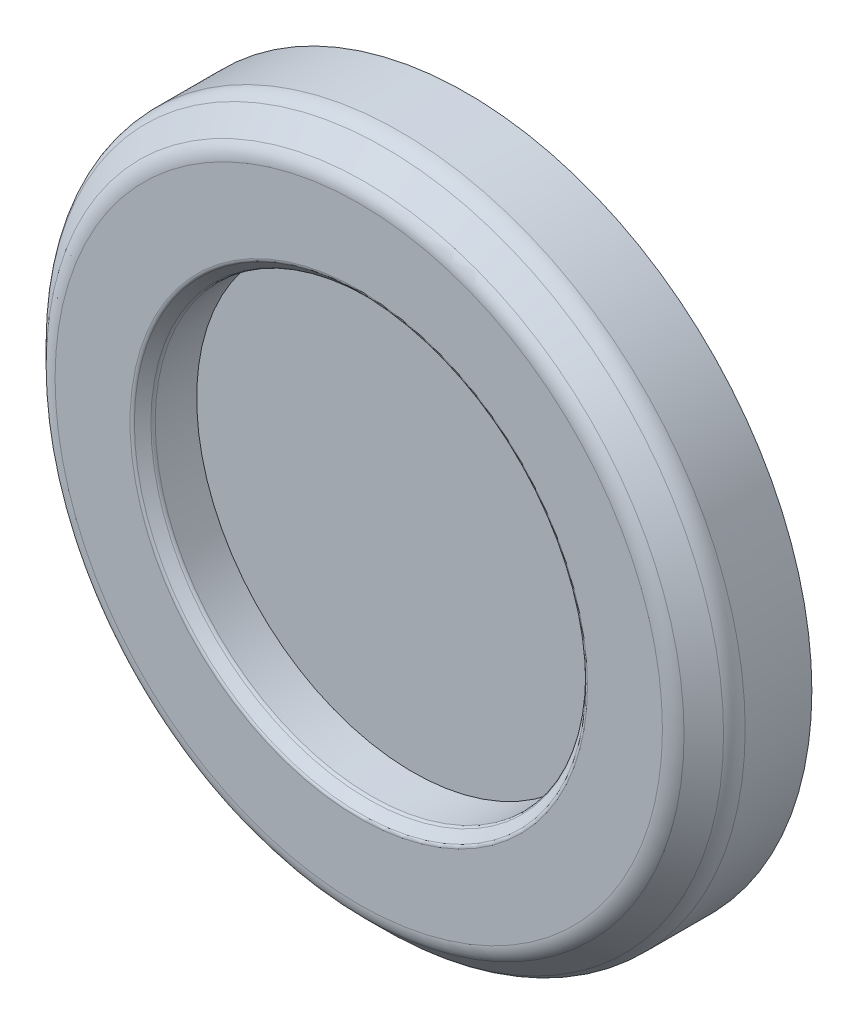
ISO-10303-21;
HEADER;
FILE_DESCRIPTION(('STEP AP214'),'2;1');
FILE_NAME('part.step','',(''),(''),'','','');
FILE_SCHEMA(('AUTOMOTIVE_DESIGN { 1 0 10303 214 1 1 1 1 }'));
ENDSEC;
DATA;
#1=APPLICATION_CONTEXT('core data for automotive mechanical design processes');
#2=APPLICATION_PROTOCOL_DEFINITION('international standard','automotive_design',2000,#1);
#3=PRODUCT_CONTEXT('',#1,'mechanical');
#4=PRODUCT('Part','Part','',(#3));
#5=PRODUCT_RELATED_PRODUCT_CATEGORY('part','',(#4));
#6=PRODUCT_DEFINITION_FORMATION('','',#4);
#7=PRODUCT_DEFINITION_CONTEXT('part definition',#1,'design');
#8=PRODUCT_DEFINITION('design','',#6,#7);
#9=PRODUCT_DEFINITION_SHAPE('','',#8);
#10=(LENGTH_UNIT() NAMED_UNIT(*) SI_UNIT(.MILLI.,.METRE.));
#11=(NAMED_UNIT(*) PLANE_ANGLE_UNIT() SI_UNIT($,.RADIAN.));
#12=(NAMED_UNIT(*) SI_UNIT($,.STERADIAN.) SOLID_ANGLE_UNIT());
#13=UNCERTAINTY_MEASURE_WITH_UNIT(LENGTH_MEASURE(1.E-05),#10,'distance_accuracy_value','');
#14=(GEOMETRIC_REPRESENTATION_CONTEXT(3) GLOBAL_UNCERTAINTY_ASSIGNED_CONTEXT((#13)) GLOBAL_UNIT_ASSIGNED_CONTEXT((#10,
#11,#12)) REPRESENTATION_CONTEXT('',''));
#15=CARTESIAN_POINT('',(0.,0.,0.));
#16=DIRECTION('',(0.,0.,1.));
#17=DIRECTION('',(1.,0.,0.));
#18=AXIS2_PLACEMENT_3D('',#15,#16,#17);
#19=CARTESIAN_POINT('',(0.,0.,10.));
#20=DIRECTION('',(0.,0.,-1.));
#21=DIRECTION('',(-1.,0.,0.));
#22=AXIS2_PLACEMENT_3D('',#19,#20,#21);
#23=CYLINDRICAL_SURFACE('',#22,31.93);
#24=CARTESIAN_POINT('',(0.,0.,6.17157287525377));
#25=DIRECTION('',(0.,0.,1.));
#26=DIRECTION('',(1.,0.,0.));
#27=AXIS2_PLACEMENT_3D('',#24,#25,#26);
#28=CIRCLE('',#27,31.93);
#29=CARTESIAN_POINT('',(31.93,0.,6.17157287525377));
#30=VERTEX_POINT('',#29);
#31=EDGE_CURVE('E70',#30,#30,#28,.F.);
#32=ORIENTED_EDGE('',*,*,#31,.T.);
#33=EDGE_LOOP('',(#32));
#34=FACE_BOUND('',#33,.T.);
#35=CARTESIAN_POINT('',(0.,0.,0.));
#36=DIRECTION('',(0.,0.,1.));
#37=DIRECTION('',(1.,0.,0.));
#38=AXIS2_PLACEMENT_3D('',#35,#36,#37);
#39=CIRCLE('',#38,31.93);
#40=CARTESIAN_POINT('',(31.93,0.,0.));
#41=VERTEX_POINT('',#40);
#42=EDGE_CURVE('E72',#41,#41,#39,.T.);
#43=ORIENTED_EDGE('',*,*,#42,.T.);
#44=EDGE_LOOP('',(#43));
#45=FACE_BOUND('',#44,.T.);
#46=ADVANCED_FACE('F39',(#34,#45),#23,.T.);
#47=CARTESIAN_POINT('',(0.,0.,10.));
#48=DIRECTION('',(0.,0.,1.));
#49=DIRECTION('',(1.,0.,0.));
#50=AXIS2_PLACEMENT_3D('',#47,#48,#49);
#51=PLANE('',#50);
#52=CARTESIAN_POINT('',(0.,0.,10.));
#53=DIRECTION('',(0.,0.,1.));
#54=DIRECTION('',(1.,0.,0.));
#55=AXIS2_PLACEMENT_3D('',#52,#53,#54);
#56=CIRCLE('',#55,21.1656854249493);
#57=CARTESIAN_POINT('',(21.1656854249493,0.,10.));
#58=VERTEX_POINT('',#57);
#59=EDGE_CURVE('E10',#58,#58,#56,.F.);
#60=ORIENTED_EDGE('',*,*,#59,.T.);
#61=EDGE_LOOP('',(#60));
#62=FACE_BOUND('',#61,.T.);
#63=CARTESIAN_POINT('',(0.,0.,10.));
#64=DIRECTION('',(0.,0.,1.));
#65=DIRECTION('',(1.,0.,0.));
#66=AXIS2_PLACEMENT_3D('',#63,#64,#65);
#67=CIRCLE('',#66,28.1015728752538);
#68=CARTESIAN_POINT('',(28.1015728752538,0.,10.));
#69=VERTEX_POINT('',#68);
#70=EDGE_CURVE('E56',#69,#69,#67,.T.);
#71=ORIENTED_EDGE('',*,*,#70,.T.);
#72=EDGE_LOOP('',(#71));
#73=FACE_BOUND('',#72,.T.);
#74=ADVANCED_FACE('F98',(#62,#73),#51,.T.);
#75=CARTESIAN_POINT('',(0.,0.,0.));
#76=DIRECTION('',(0.,0.,1.));
#77=DIRECTION('',(1.,0.,0.));
#78=AXIS2_PLACEMENT_3D('',#75,#76,#77);
#79=PLANE('',#78);
#80=ORIENTED_EDGE('',*,*,#42,.F.);
#81=EDGE_LOOP('',(#80));
#82=FACE_BOUND('',#81,.T.);
#83=ADVANCED_FACE('F104',(#82),#79,.F.);
#84=CARTESIAN_POINT('',(0.,0.,10.));
#85=DIRECTION('',(0.,0.,-1.));
#86=DIRECTION('',(-1.,0.,0.));
#87=AXIS2_PLACEMENT_3D('',#84,#85,#86);
#88=CONICAL_SURFACE('',#87,28.93,0.785398163397446);
#89=CARTESIAN_POINT('',(0.,0.,7.58578643762686));
#90=DIRECTION('',(0.,0.,-1.));
#91=DIRECTION('',(-1.,0.,0.));
#92=AXIS2_PLACEMENT_3D('',#89,#90,#91);
#93=CIRCLE('',#92,31.3442135623731);
#94=CARTESIAN_POINT('',(-31.3442135623731,0.,7.58578643762686));
#95=VERTEX_POINT('',#94);
#96=EDGE_CURVE('E65',#95,#95,#93,.F.);
#97=ORIENTED_EDGE('',*,*,#96,.T.);
#98=EDGE_LOOP('',(#97));
#99=FACE_BOUND('',#98,.T.);
#100=CARTESIAN_POINT('',(0.,0.,9.41421356237309));
#101=DIRECTION('',(0.,0.,1.));
#102=DIRECTION('',(1.,0.,0.));
#103=AXIS2_PLACEMENT_3D('',#100,#101,#102);
#104=CIRCLE('',#103,29.5157864376269);
#105=CARTESIAN_POINT('',(29.5157864376269,0.,9.41421356237309));
#106=VERTEX_POINT('',#105);
#107=EDGE_CURVE('E62',#106,#106,#104,.F.);
#108=ORIENTED_EDGE('',*,*,#107,.T.);
#109=EDGE_LOOP('',(#108));
#110=FACE_BOUND('',#109,.T.);
#111=ADVANCED_FACE('F109',(#99,#110),#88,.T.);
#112=CARTESIAN_POINT('',(0.,0.,6.17157287525377));
#113=DIRECTION('',(0.,0.,1.));
#114=DIRECTION('',(1.,0.,0.));
#115=AXIS2_PLACEMENT_3D('',#112,#113,#114);
#116=TOROIDAL_SURFACE('',#115,29.93,2.);
#117=ORIENTED_EDGE('',*,*,#96,.F.);
#118=EDGE_LOOP('',(#117));
#119=FACE_BOUND('',#118,.T.);
#120=ORIENTED_EDGE('',*,*,#31,.F.);
#121=EDGE_LOOP('',(#120));
#122=FACE_BOUND('',#121,.T.);
#123=ADVANCED_FACE('F91',(#119,#122),#116,.T.);
#124=CARTESIAN_POINT('',(0.,0.,8.));
#125=DIRECTION('',(0.,0.,1.));
#126=DIRECTION('',(1.,0.,0.));
#127=AXIS2_PLACEMENT_3D('',#124,#125,#126);
#128=TOROIDAL_SURFACE('',#127,28.1015728752538,2.);
#129=ORIENTED_EDGE('',*,*,#107,.F.);
#130=EDGE_LOOP('',(#129));
#131=FACE_BOUND('',#130,.T.);
#132=ORIENTED_EDGE('',*,*,#70,.F.);
#133=EDGE_LOOP('',(#132));
#134=FACE_BOUND('',#133,.T.);
#135=ADVANCED_FACE('F84',(#131,#134),#128,.T.);
#136=CARTESIAN_POINT('',(0.,0.,5.));
#137=DIRECTION('',(0.,0.,1.));
#138=DIRECTION('',(1.,0.,0.));
#139=AXIS2_PLACEMENT_3D('',#136,#137,#138);
#140=CYLINDRICAL_SURFACE('',#139,20.);
#141=CARTESIAN_POINT('',(0.,0.,8.83431457505074));
#142=DIRECTION('',(0.,0.,-1.));
#143=DIRECTION('',(-1.,0.,0.));
#144=AXIS2_PLACEMENT_3D('',#141,#142,#143);
#145=CIRCLE('',#144,20.);
#146=CARTESIAN_POINT('',(-20.,0.,8.83431457505074));
#147=VERTEX_POINT('',#146);
#148=EDGE_CURVE('E53',#147,#147,#145,.F.);
#149=ORIENTED_EDGE('',*,*,#148,.T.);
#150=EDGE_LOOP('',(#149));
#151=FACE_BOUND('',#150,.T.);
#152=CARTESIAN_POINT('',(0.,0.,5.));
#153=DIRECTION('',(0.,0.,1.));
#154=DIRECTION('',(1.,0.,0.));
#155=AXIS2_PLACEMENT_3D('',#152,#153,#154);
#156=CIRCLE('',#155,20.);
#157=CARTESIAN_POINT('',(20.,0.,5.));
#158=VERTEX_POINT('',#157);
#159=EDGE_CURVE('E74',#158,#158,#156,.T.);
#160=ORIENTED_EDGE('',*,*,#159,.F.);
#161=EDGE_LOOP('',(#160));
#162=FACE_BOUND('',#161,.T.);
#163=ADVANCED_FACE('F77',(#151,#162),#140,.F.);
#164=CARTESIAN_POINT('',(0.,0.,5.));
#165=DIRECTION('',(0.,0.,1.));
#166=DIRECTION('',(1.,0.,0.));
#167=AXIS2_PLACEMENT_3D('',#164,#165,#166);
#168=PLANE('',#167);
#169=ORIENTED_EDGE('',*,*,#159,.T.);
#170=EDGE_LOOP('',(#169));
#171=FACE_BOUND('',#170,.T.);
#172=ADVANCED_FACE('F76',(#171),#168,.T.);
#173=CARTESIAN_POINT('',(0.,0.,8.99999999999998));
#174=DIRECTION('',(0.,0.,1.));
#175=DIRECTION('',(1.,0.,0.));
#176=AXIS2_PLACEMENT_3D('',#173,#174,#175);
#177=CONICAL_SURFACE('',#176,20.,0.785398163397448);
#178=CARTESIAN_POINT('',(0.,0.,9.11715728752537));
#179=DIRECTION('',(0.,0.,1.));
#180=DIRECTION('',(1.,0.,0.));
#181=AXIS2_PLACEMENT_3D('',#178,#179,#180);
#182=CIRCLE('',#181,20.1171572875254);
#183=CARTESIAN_POINT('',(20.1171572875254,0.,9.11715728752537));
#184=VERTEX_POINT('',#183);
#185=EDGE_CURVE('E46',#184,#184,#182,.F.);
#186=ORIENTED_EDGE('',*,*,#185,.T.);
#187=EDGE_LOOP('',(#186));
#188=FACE_BOUND('',#187,.T.);
#189=CARTESIAN_POINT('',(0.,0.,9.88284271247461));
#190=DIRECTION('',(0.,0.,-1.));
#191=DIRECTION('',(-1.,0.,0.));
#192=AXIS2_PLACEMENT_3D('',#189,#190,#191);
#193=CIRCLE('',#192,20.8828427124746);
#194=CARTESIAN_POINT('',(-20.8828427124746,0.,9.88284271247461));
#195=VERTEX_POINT('',#194);
#196=EDGE_CURVE('E49',#195,#195,#193,.F.);
#197=ORIENTED_EDGE('',*,*,#196,.T.);
#198=EDGE_LOOP('',(#197));
#199=FACE_BOUND('',#198,.T.);
#200=ADVANCED_FACE('F89',(#188,#199),#177,.F.);
#201=CARTESIAN_POINT('',(0.,0.,8.83431457505074));
#202=DIRECTION('',(0.,0.,-1.));
#203=DIRECTION('',(-1.,0.,0.));
#204=AXIS2_PLACEMENT_3D('',#201,#202,#203);
#205=TOROIDAL_SURFACE('',#204,20.4,0.4);
#206=ORIENTED_EDGE('',*,*,#185,.F.);
#207=EDGE_LOOP('',(#206));
#208=FACE_BOUND('',#207,.T.);
#209=ORIENTED_EDGE('',*,*,#148,.F.);
#210=EDGE_LOOP('',(#209));
#211=FACE_BOUND('',#210,.T.);
#212=ADVANCED_FACE('F122',(#208,#211),#205,.T.);
#213=CARTESIAN_POINT('',(0.,0.,9.6));
#214=DIRECTION('',(0.,0.,1.));
#215=DIRECTION('',(1.,0.,0.));
#216=AXIS2_PLACEMENT_3D('',#213,#214,#215);
#217=TOROIDAL_SURFACE('',#216,21.1656854249493,0.4);
#218=ORIENTED_EDGE('',*,*,#196,.F.);
#219=EDGE_LOOP('',(#218));
#220=FACE_BOUND('',#219,.T.);
#221=ORIENTED_EDGE('',*,*,#59,.F.);
#222=EDGE_LOOP('',(#221));
#223=FACE_BOUND('',#222,.T.);
#224=ADVANCED_FACE('F41',(#220,#223),#217,.T.);
#225=CLOSED_SHELL('',(#46,#74,#83,#111,#123,#135,#163,#172,#200,#212,#224));
#226=MANIFOLD_SOLID_BREP('B2',#225);
#227=ADVANCED_BREP_SHAPE_REPRESENTATION('',(#18,#226),#14);
#228=SHAPE_DEFINITION_REPRESENTATION(#9,#227);
ENDSEC;
END-ISO-10303-21;
